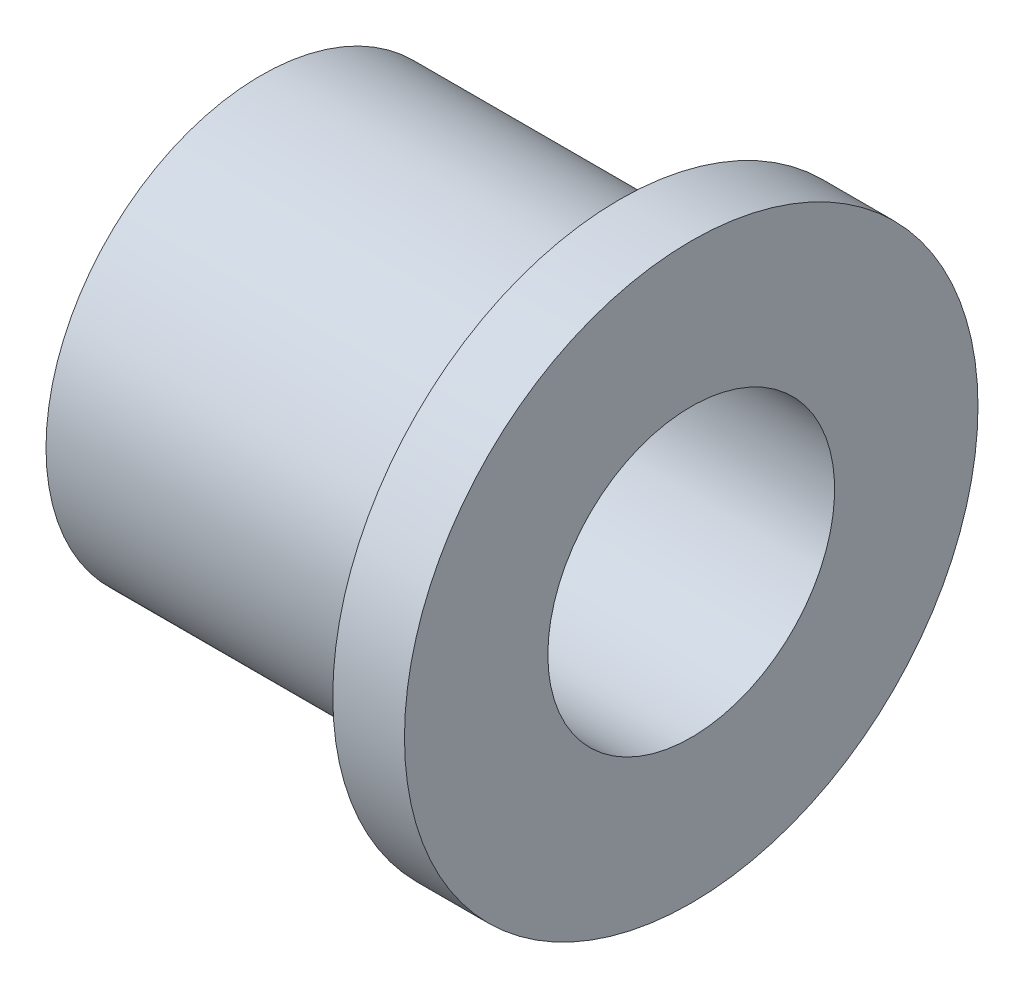
ISO-10303-21;
HEADER;
FILE_DESCRIPTION(('STEP AP214'),'2;1');
FILE_NAME('part.step','',(''),(''),'','','');
FILE_SCHEMA(('AUTOMOTIVE_DESIGN { 1 0 10303 214 1 1 1 1 }'));
ENDSEC;
DATA;
#1=APPLICATION_CONTEXT('core data for automotive mechanical design processes');
#2=APPLICATION_PROTOCOL_DEFINITION('international standard','automotive_design',2000,#1);
#3=PRODUCT_CONTEXT('',#1,'mechanical');
#4=PRODUCT('Part','Part','',(#3));
#5=PRODUCT_RELATED_PRODUCT_CATEGORY('part','',(#4));
#6=PRODUCT_DEFINITION_FORMATION('','',#4);
#7=PRODUCT_DEFINITION_CONTEXT('part definition',#1,'design');
#8=PRODUCT_DEFINITION('design','',#6,#7);
#9=PRODUCT_DEFINITION_SHAPE('','',#8);
#10=(LENGTH_UNIT() NAMED_UNIT(*) SI_UNIT(.MILLI.,.METRE.));
#11=(NAMED_UNIT(*) PLANE_ANGLE_UNIT() SI_UNIT($,.RADIAN.));
#12=(NAMED_UNIT(*) SI_UNIT($,.STERADIAN.) SOLID_ANGLE_UNIT());
#13=UNCERTAINTY_MEASURE_WITH_UNIT(LENGTH_MEASURE(1.E-05),#10,'distance_accuracy_value','');
#14=(GEOMETRIC_REPRESENTATION_CONTEXT(3) GLOBAL_UNCERTAINTY_ASSIGNED_CONTEXT((#13)) GLOBAL_UNIT_ASSIGNED_CONTEXT((#10,
#11,#12)) REPRESENTATION_CONTEXT('',''));
#15=CARTESIAN_POINT('',(0.,0.,0.));
#16=DIRECTION('',(0.,0.,1.));
#17=DIRECTION('',(1.,0.,0.));
#18=AXIS2_PLACEMENT_3D('',#15,#16,#17);
#19=CARTESIAN_POINT('',(0.,0.,0.));
#20=DIRECTION('',(-1.,0.,0.));
#21=DIRECTION('',(0.,0.,1.));
#22=AXIS2_PLACEMENT_3D('',#19,#20,#21);
#23=CYLINDRICAL_SURFACE('',#22,4.);
#24=CARTESIAN_POINT('',(12.,0.,0.));
#25=DIRECTION('',(-1.,0.,0.));
#26=DIRECTION('',(0.,0.,1.));
#27=AXIS2_PLACEMENT_3D('',#24,#25,#26);
#28=CIRCLE('',#27,4.);
#29=CARTESIAN_POINT('',(12.,0.,4.));
#30=VERTEX_POINT('',#29);
#31=EDGE_CURVE('E70',#30,#30,#28,.T.);
#32=ORIENTED_EDGE('',*,*,#31,.F.);
#33=EDGE_LOOP('',(#32));
#34=FACE_BOUND('',#33,.T.);
#35=CARTESIAN_POINT('',(0.,0.,0.));
#36=DIRECTION('',(-1.,0.,0.));
#37=DIRECTION('',(0.,0.,1.));
#38=AXIS2_PLACEMENT_3D('',#35,#36,#37);
#39=CIRCLE('',#38,4.);
#40=CARTESIAN_POINT('',(0.,0.,4.));
#41=VERTEX_POINT('',#40);
#42=EDGE_CURVE('E10',#41,#41,#39,.T.);
#43=ORIENTED_EDGE('',*,*,#42,.T.);
#44=EDGE_LOOP('',(#43));
#45=FACE_BOUND('',#44,.T.);
#46=ADVANCED_FACE('F43',(#34,#45),#23,.F.);
#47=CARTESIAN_POINT('',(0.,0.,-4.));
#48=DIRECTION('',(1.,0.,0.));
#49=DIRECTION('',(0.,0.,-1.));
#50=AXIS2_PLACEMENT_3D('',#47,#48,#49);
#51=PLANE('',#50);
#52=ORIENTED_EDGE('',*,*,#42,.F.);
#53=EDGE_LOOP('',(#52));
#54=FACE_BOUND('',#53,.T.);
#55=CARTESIAN_POINT('',(0.,0.,0.));
#56=DIRECTION('',(-1.,0.,0.));
#57=DIRECTION('',(0.,0.,1.));
#58=AXIS2_PLACEMENT_3D('',#55,#56,#57);
#59=CIRCLE('',#58,6.);
#60=CARTESIAN_POINT('',(0.,0.,6.));
#61=VERTEX_POINT('',#60);
#62=EDGE_CURVE('E50',#61,#61,#59,.T.);
#63=ORIENTED_EDGE('',*,*,#62,.T.);
#64=EDGE_LOOP('',(#63));
#65=FACE_BOUND('',#64,.T.);
#66=ADVANCED_FACE('F78',(#54,#65),#51,.F.);
#67=CARTESIAN_POINT('',(0.,0.,0.));
#68=DIRECTION('',(-1.,0.,0.));
#69=DIRECTION('',(0.,0.,1.));
#70=AXIS2_PLACEMENT_3D('',#67,#68,#69);
#71=CYLINDRICAL_SURFACE('',#70,6.);
#72=ORIENTED_EDGE('',*,*,#62,.F.);
#73=EDGE_LOOP('',(#72));
#74=FACE_BOUND('',#73,.T.);
#75=CARTESIAN_POINT('',(10.,0.,0.));
#76=DIRECTION('',(-1.,0.,0.));
#77=DIRECTION('',(0.,0.,1.));
#78=AXIS2_PLACEMENT_3D('',#75,#76,#77);
#79=CIRCLE('',#78,6.);
#80=CARTESIAN_POINT('',(10.,0.,6.));
#81=VERTEX_POINT('',#80);
#82=EDGE_CURVE('E55',#81,#81,#79,.T.);
#83=ORIENTED_EDGE('',*,*,#82,.T.);
#84=EDGE_LOOP('',(#83));
#85=FACE_BOUND('',#84,.T.);
#86=ADVANCED_FACE('F82',(#74,#85),#71,.T.);
#87=CARTESIAN_POINT('',(10.,0.,-6.));
#88=DIRECTION('',(1.,0.,0.));
#89=DIRECTION('',(0.,0.,-1.));
#90=AXIS2_PLACEMENT_3D('',#87,#88,#89);
#91=PLANE('',#90);
#92=ORIENTED_EDGE('',*,*,#82,.F.);
#93=EDGE_LOOP('',(#92));
#94=FACE_BOUND('',#93,.T.);
#95=CARTESIAN_POINT('',(10.,0.,0.));
#96=DIRECTION('',(-1.,0.,0.));
#97=DIRECTION('',(0.,0.,1.));
#98=AXIS2_PLACEMENT_3D('',#95,#96,#97);
#99=CIRCLE('',#98,8.);
#100=CARTESIAN_POINT('',(10.,0.,8.));
#101=VERTEX_POINT('',#100);
#102=EDGE_CURVE('E60',#101,#101,#99,.T.);
#103=ORIENTED_EDGE('',*,*,#102,.T.);
#104=EDGE_LOOP('',(#103));
#105=FACE_BOUND('',#104,.T.);
#106=ADVANCED_FACE('F87',(#94,#105),#91,.F.);
#107=CARTESIAN_POINT('',(0.,0.,0.));
#108=DIRECTION('',(-1.,0.,0.));
#109=DIRECTION('',(0.,0.,1.));
#110=AXIS2_PLACEMENT_3D('',#107,#108,#109);
#111=CYLINDRICAL_SURFACE('',#110,8.);
#112=ORIENTED_EDGE('',*,*,#102,.F.);
#113=EDGE_LOOP('',(#112));
#114=FACE_BOUND('',#113,.T.);
#115=CARTESIAN_POINT('',(12.,0.,0.));
#116=DIRECTION('',(-1.,0.,0.));
#117=DIRECTION('',(0.,0.,1.));
#118=AXIS2_PLACEMENT_3D('',#115,#116,#117);
#119=CIRCLE('',#118,8.);
#120=CARTESIAN_POINT('',(12.,0.,8.));
#121=VERTEX_POINT('',#120);
#122=EDGE_CURVE('E66',#121,#121,#119,.T.);
#123=ORIENTED_EDGE('',*,*,#122,.T.);
#124=EDGE_LOOP('',(#123));
#125=FACE_BOUND('',#124,.T.);
#126=ADVANCED_FACE('F93',(#114,#125),#111,.T.);
#127=CARTESIAN_POINT('',(12.,0.,-8.));
#128=DIRECTION('',(-1.,0.,0.));
#129=DIRECTION('',(0.,0.,1.));
#130=AXIS2_PLACEMENT_3D('',#127,#128,#129);
#131=PLANE('',#130);
#132=ORIENTED_EDGE('',*,*,#122,.F.);
#133=EDGE_LOOP('',(#132));
#134=FACE_BOUND('',#133,.T.);
#135=ORIENTED_EDGE('',*,*,#31,.T.);
#136=EDGE_LOOP('',(#135));
#137=FACE_BOUND('',#136,.T.);
#138=ADVANCED_FACE('F75',(#134,#137),#131,.F.);
#139=CLOSED_SHELL('',(#46,#66,#86,#106,#126,#138));
#140=MANIFOLD_SOLID_BREP('B2',#139);
#141=ADVANCED_BREP_SHAPE_REPRESENTATION('',(#18,#140),#14);
#142=SHAPE_DEFINITION_REPRESENTATION(#9,#141);
ENDSEC;
END-ISO-10303-21;
